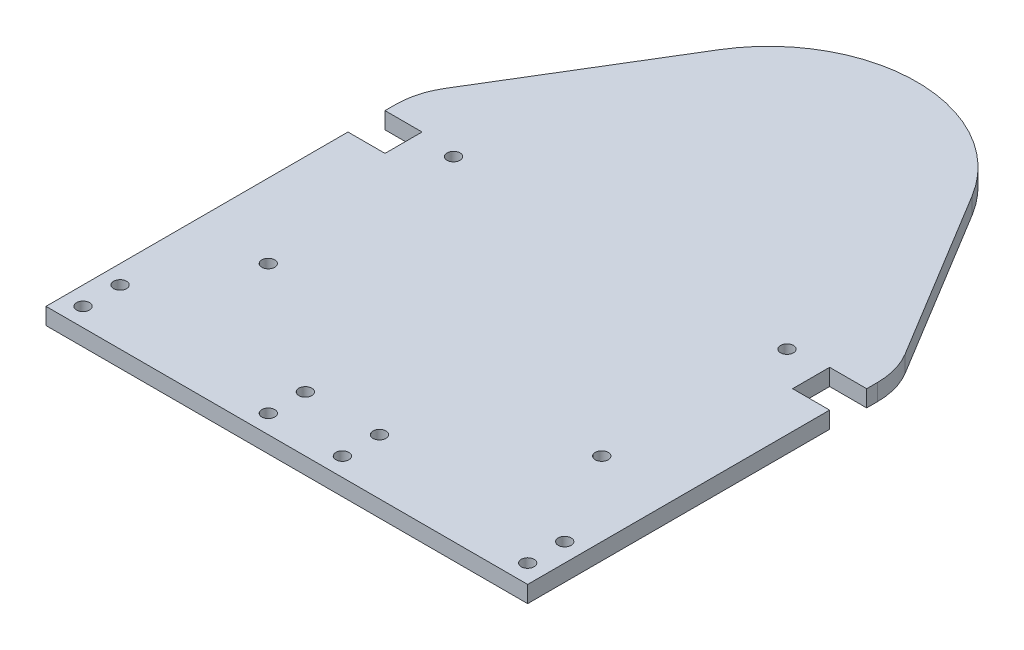
ISO-10303-21;
HEADER;
FILE_DESCRIPTION(('STEP AP214'),'2;1');
FILE_NAME('part.step','',(''),(''),'','','');
FILE_SCHEMA(('AUTOMOTIVE_DESIGN { 1 0 10303 214 1 1 1 1 }'));
ENDSEC;
DATA;
#1=APPLICATION_CONTEXT('core data for automotive mechanical design processes');
#2=APPLICATION_PROTOCOL_DEFINITION('international standard','automotive_design',2000,#1);
#3=PRODUCT_CONTEXT('',#1,'mechanical');
#4=PRODUCT('Part','Part','',(#3));
#5=PRODUCT_RELATED_PRODUCT_CATEGORY('part','',(#4));
#6=PRODUCT_DEFINITION_FORMATION('','',#4);
#7=PRODUCT_DEFINITION_CONTEXT('part definition',#1,'design');
#8=PRODUCT_DEFINITION('design','',#6,#7);
#9=PRODUCT_DEFINITION_SHAPE('','',#8);
#10=(LENGTH_UNIT() NAMED_UNIT(*) SI_UNIT(.MILLI.,.METRE.));
#11=(NAMED_UNIT(*) PLANE_ANGLE_UNIT() SI_UNIT($,.RADIAN.));
#12=(NAMED_UNIT(*) SI_UNIT($,.STERADIAN.) SOLID_ANGLE_UNIT());
#13=UNCERTAINTY_MEASURE_WITH_UNIT(LENGTH_MEASURE(1.E-05),#10,'distance_accuracy_value','');
#14=(GEOMETRIC_REPRESENTATION_CONTEXT(3) GLOBAL_UNCERTAINTY_ASSIGNED_CONTEXT((#13)) GLOBAL_UNIT_ASSIGNED_CONTEXT((#10,
#11,#12)) REPRESENTATION_CONTEXT('',''));
#15=CARTESIAN_POINT('',(0.,0.,0.));
#16=DIRECTION('',(0.,0.,1.));
#17=DIRECTION('',(1.,0.,0.));
#18=AXIS2_PLACEMENT_3D('',#15,#16,#17);
#19=CARTESIAN_POINT('',(65.,4.5,-25.));
#20=DIRECTION('',(-1.,0.,0.));
#21=DIRECTION('',(0.,0.,1.));
#22=AXIS2_PLACEMENT_3D('',#19,#20,#21);
#23=PLANE('',#22);
#24=DIRECTION('',(0.,0.,-1.));
#25=VECTOR('',#24,1.);
#26=CARTESIAN_POINT('',(65.,0.,-25.));
#27=LINE('',#26,#25);
#28=CARTESIAN_POINT('',(65.,0.,75.));
#29=VERTEX_POINT('',#28);
#30=CARTESIAN_POINT('',(65.,0.,-6.50000000000002));
#31=VERTEX_POINT('',#30);
#32=EDGE_CURVE('E288',#29,#31,#27,.T.);
#33=ORIENTED_EDGE('',*,*,#32,.T.);
#34=DIRECTION('',(0.,1.,0.));
#35=VECTOR('',#34,1.);
#36=CARTESIAN_POINT('',(65.,0.,-6.50000000000002));
#37=LINE('',#36,#35);
#38=CARTESIAN_POINT('',(65.,4.5,-6.50000000000002));
#39=VERTEX_POINT('',#38);
#40=EDGE_CURVE('E259',#31,#39,#37,.T.);
#41=ORIENTED_EDGE('',*,*,#40,.T.);
#42=DIRECTION('',(0.,0.,-1.));
#43=VECTOR('',#42,1.);
#44=CARTESIAN_POINT('',(65.,4.5,-25.));
#45=LINE('',#44,#43);
#46=CARTESIAN_POINT('',(65.,4.5,75.));
#47=VERTEX_POINT('',#46);
#48=EDGE_CURVE('E276',#47,#39,#45,.T.);
#49=ORIENTED_EDGE('',*,*,#48,.F.);
#50=DIRECTION('',(0.,-1.,0.));
#51=VECTOR('',#50,1.);
#52=CARTESIAN_POINT('',(65.,4.5,75.));
#53=LINE('',#52,#51);
#54=EDGE_CURVE('E195',#47,#29,#53,.T.);
#55=ORIENTED_EDGE('',*,*,#54,.T.);
#56=EDGE_LOOP('',(#33,#41,#49,#55));
#57=FACE_BOUND('',#56,.T.);
#58=ADVANCED_FACE('F49',(#57),#23,.F.);
#59=CARTESIAN_POINT('',(-65.,4.5,-25.));
#60=DIRECTION('',(1.,0.,0.));
#61=DIRECTION('',(0.,0.,-1.));
#62=AXIS2_PLACEMENT_3D('',#59,#60,#61);
#63=PLANE('',#62);
#64=DIRECTION('',(0.,0.,1.));
#65=VECTOR('',#64,1.);
#66=CARTESIAN_POINT('',(-65.,0.,-25.));
#67=LINE('',#66,#65);
#68=CARTESIAN_POINT('',(-65.,0.,-19.4053884885353));
#69=VERTEX_POINT('',#68);
#70=CARTESIAN_POINT('',(-65.,0.,-16.5));
#71=VERTEX_POINT('',#70);
#72=EDGE_CURVE('E184',#69,#71,#67,.T.);
#73=ORIENTED_EDGE('',*,*,#72,.T.);
#74=DIRECTION('',(0.,1.,0.));
#75=VECTOR('',#74,1.);
#76=CARTESIAN_POINT('',(-65.,0.,-16.5));
#77=LINE('',#76,#75);
#78=CARTESIAN_POINT('',(-65.,4.5,-16.5));
#79=VERTEX_POINT('',#78);
#80=EDGE_CURVE('E246',#71,#79,#77,.T.);
#81=ORIENTED_EDGE('',*,*,#80,.T.);
#82=DIRECTION('',(0.,0.,1.));
#83=VECTOR('',#82,1.);
#84=CARTESIAN_POINT('',(-65.,4.5,-25.));
#85=LINE('',#84,#83);
#86=CARTESIAN_POINT('',(-65.,4.5,-19.4053884885353));
#87=VERTEX_POINT('',#86);
#88=EDGE_CURVE('E229',#87,#79,#85,.T.);
#89=ORIENTED_EDGE('',*,*,#88,.F.);
#90=DIRECTION('',(0.,-1.,0.));
#91=VECTOR('',#90,1.);
#92=CARTESIAN_POINT('',(-65.,4.5,-19.4053884885353));
#93=LINE('',#92,#91);
#94=EDGE_CURVE('E57',#87,#69,#93,.T.);
#95=ORIENTED_EDGE('',*,*,#94,.T.);
#96=EDGE_LOOP('',(#73,#81,#89,#95));
#97=FACE_BOUND('',#96,.T.);
#98=ADVANCED_FACE('F226',(#97),#63,.F.);
#99=CARTESIAN_POINT('',(65.,4.5,-16.5));
#100=VERTEX_POINT('',#99);
#101=CARTESIAN_POINT('',(65.,4.5,-19.4053884885353));
#102=VERTEX_POINT('',#101);
#103=EDGE_CURVE('E194',#100,#102,#45,.T.);
#104=ORIENTED_EDGE('',*,*,#103,.F.);
#105=DIRECTION('',(0.,1.,0.));
#106=VECTOR('',#105,1.);
#107=CARTESIAN_POINT('',(65.,0.,-16.5));
#108=LINE('',#107,#106);
#109=CARTESIAN_POINT('',(65.,0.,-16.5));
#110=VERTEX_POINT('',#109);
#111=EDGE_CURVE('E252',#110,#100,#108,.T.);
#112=ORIENTED_EDGE('',*,*,#111,.F.);
#113=CARTESIAN_POINT('',(65.,0.,-19.4053884885353));
#114=VERTEX_POINT('',#113);
#115=EDGE_CURVE('E248',#110,#114,#27,.T.);
#116=ORIENTED_EDGE('',*,*,#115,.T.);
#117=DIRECTION('',(0.,-1.,0.));
#118=VECTOR('',#117,1.);
#119=CARTESIAN_POINT('',(65.,4.5,-19.4053884885353));
#120=LINE('',#119,#118);
#121=EDGE_CURVE('E215',#114,#102,#120,.F.);
#122=ORIENTED_EDGE('',*,*,#121,.T.);
#123=EDGE_LOOP('',(#104,#112,#116,#122));
#124=FACE_BOUND('',#123,.T.);
#125=ADVANCED_FACE('F321',(#124),#23,.F.);
#126=CARTESIAN_POINT('',(65.,4.5,-25.));
#127=DIRECTION('',(-0.854858792791353,0.,0.5188607177146));
#128=DIRECTION('',(0.5188607177146,0.,0.854858792791353));
#129=AXIS2_PLACEMENT_3D('',#126,#127,#128);
#130=PLANE('',#129);
#131=DIRECTION('',(-0.5188607177146,0.,-0.854858792791353));
#132=VECTOR('',#131,1.);
#133=CARTESIAN_POINT('',(65.,4.5,-25.));
#134=LINE('',#133,#132);
#135=CARTESIAN_POINT('',(62.0971758558271,4.5,-29.7826028428273));
#136=VERTEX_POINT('',#135);
#137=CARTESIAN_POINT('',(34.1943517116541,4.5,-75.754428708584));
#138=VERTEX_POINT('',#137);
#139=EDGE_CURVE('E279',#136,#138,#134,.T.);
#140=ORIENTED_EDGE('',*,*,#139,.F.);
#141=DIRECTION('',(0.,-1.,0.));
#142=VECTOR('',#141,1.);
#143=CARTESIAN_POINT('',(62.0971758558271,4.5,-29.7826028428273));
#144=LINE('',#143,#142);
#145=CARTESIAN_POINT('',(62.0971758558271,0.,-29.7826028428273));
#146=VERTEX_POINT('',#145);
#147=EDGE_CURVE('E207',#136,#146,#144,.T.);
#148=ORIENTED_EDGE('',*,*,#147,.T.);
#149=DIRECTION('',(-0.5188607177146,0.,-0.854858792791353));
#150=VECTOR('',#149,1.);
#151=CARTESIAN_POINT('',(65.,0.,-25.));
#152=LINE('',#151,#150);
#153=CARTESIAN_POINT('',(34.1943517116541,0.,-75.754428708584));
#154=VERTEX_POINT('',#153);
#155=EDGE_CURVE('E291',#146,#154,#152,.T.);
#156=ORIENTED_EDGE('',*,*,#155,.T.);
#157=DIRECTION('',(0.,-1.,0.));
#158=VECTOR('',#157,1.);
#159=CARTESIAN_POINT('',(34.1943517116541,4.5,-75.754428708584));
#160=LINE('',#159,#158);
#161=EDGE_CURVE('E204',#138,#154,#160,.T.);
#162=ORIENTED_EDGE('',*,*,#161,.F.);
#163=EDGE_LOOP('',(#140,#148,#156,#162));
#164=FACE_BOUND('',#163,.T.);
#165=ADVANCED_FACE('F328',(#164),#130,.F.);
#166=CARTESIAN_POINT('',(0.,4.5,-55.));
#167=DIRECTION('',(0.,-1.,0.));
#168=DIRECTION('',(0.,0.,-1.));
#169=AXIS2_PLACEMENT_3D('',#166,#167,#168);
#170=CYLINDRICAL_SURFACE('',#169,40.);
#171=CARTESIAN_POINT('',(0.,0.,-55.));
#172=DIRECTION('',(0.,1.,0.));
#173=DIRECTION('',(0.,0.,1.));
#174=AXIS2_PLACEMENT_3D('',#171,#172,#173);
#175=CIRCLE('',#174,40.);
#176=CARTESIAN_POINT('',(-34.1943517116542,0.,-75.754428708584));
#177=VERTEX_POINT('',#176);
#178=EDGE_CURVE('E189',#154,#177,#175,.T.);
#179=ORIENTED_EDGE('',*,*,#178,.T.);
#180=DIRECTION('',(0.,-1.,0.));
#181=VECTOR('',#180,1.);
#182=CARTESIAN_POINT('',(-34.1943517116542,4.5,-75.754428708584));
#183=LINE('',#182,#181);
#184=CARTESIAN_POINT('',(-34.1943517116542,4.5,-75.754428708584));
#185=VERTEX_POINT('',#184);
#186=EDGE_CURVE('E201',#185,#177,#183,.T.);
#187=ORIENTED_EDGE('',*,*,#186,.F.);
#188=CARTESIAN_POINT('',(0.,4.5,-55.));
#189=DIRECTION('',(0.,1.,0.));
#190=DIRECTION('',(0.,0.,1.));
#191=AXIS2_PLACEMENT_3D('',#188,#189,#190);
#192=CIRCLE('',#191,40.);
#193=EDGE_CURVE('E281',#138,#185,#192,.T.);
#194=ORIENTED_EDGE('',*,*,#193,.F.);
#195=ORIENTED_EDGE('',*,*,#161,.T.);
#196=EDGE_LOOP('',(#179,#187,#194,#195));
#197=FACE_BOUND('',#196,.T.);
#198=ADVANCED_FACE('F295',(#197),#170,.T.);
#199=CARTESIAN_POINT('',(-65.,4.5,-25.));
#200=DIRECTION('',(0.854858792791354,0.,0.5188607177146));
#201=DIRECTION('',(0.5188607177146,0.,-0.854858792791354));
#202=AXIS2_PLACEMENT_3D('',#199,#200,#201);
#203=PLANE('',#202);
#204=DIRECTION('',(-0.5188607177146,0.,0.854858792791354));
#205=VECTOR('',#204,1.);
#206=CARTESIAN_POINT('',(-65.,0.,-25.));
#207=LINE('',#206,#205);
#208=CARTESIAN_POINT('',(-62.0971758558271,0.,-29.7826028428273));
#209=VERTEX_POINT('',#208);
#210=EDGE_CURVE('E185',#177,#209,#207,.T.);
#211=ORIENTED_EDGE('',*,*,#210,.T.);
#212=DIRECTION('',(0.,-1.,0.));
#213=VECTOR('',#212,1.);
#214=CARTESIAN_POINT('',(-62.0971758558271,4.5,-29.7826028428273));
#215=LINE('',#214,#213);
#216=CARTESIAN_POINT('',(-62.0971758558271,4.5,-29.7826028428273));
#217=VERTEX_POINT('',#216);
#218=EDGE_CURVE('E11',#209,#217,#215,.F.);
#219=ORIENTED_EDGE('',*,*,#218,.T.);
#220=DIRECTION('',(-0.5188607177146,0.,0.854858792791354));
#221=VECTOR('',#220,1.);
#222=CARTESIAN_POINT('',(-65.,4.5,-25.));
#223=LINE('',#222,#221);
#224=EDGE_CURVE('E283',#185,#217,#223,.T.);
#225=ORIENTED_EDGE('',*,*,#224,.F.);
#226=ORIENTED_EDGE('',*,*,#186,.T.);
#227=EDGE_LOOP('',(#211,#219,#225,#226));
#228=FACE_BOUND('',#227,.T.);
#229=ADVANCED_FACE('F301',(#228),#203,.F.);
#230=CARTESIAN_POINT('',(-65.,4.5,-6.49999999999999));
#231=VERTEX_POINT('',#230);
#232=CARTESIAN_POINT('',(-65.,4.5,75.));
#233=VERTEX_POINT('',#232);
#234=EDGE_CURVE('E177',#231,#233,#85,.T.);
#235=ORIENTED_EDGE('',*,*,#234,.F.);
#236=DIRECTION('',(0.,1.,0.));
#237=VECTOR('',#236,1.);
#238=CARTESIAN_POINT('',(-65.,0.,-6.49999999999999));
#239=LINE('',#238,#237);
#240=CARTESIAN_POINT('',(-65.,0.,-6.49999999999999));
#241=VERTEX_POINT('',#240);
#242=EDGE_CURVE('E164',#241,#231,#239,.T.);
#243=ORIENTED_EDGE('',*,*,#242,.F.);
#244=CARTESIAN_POINT('',(-65.,0.,75.));
#245=VERTEX_POINT('',#244);
#246=EDGE_CURVE('E175',#241,#245,#67,.T.);
#247=ORIENTED_EDGE('',*,*,#246,.T.);
#248=DIRECTION('',(0.,-1.,0.));
#249=VECTOR('',#248,1.);
#250=CARTESIAN_POINT('',(-65.,4.5,75.));
#251=LINE('',#250,#249);
#252=EDGE_CURVE('E198',#233,#245,#251,.T.);
#253=ORIENTED_EDGE('',*,*,#252,.F.);
#254=EDGE_LOOP('',(#235,#243,#247,#253));
#255=FACE_BOUND('',#254,.T.);
#256=ADVANCED_FACE('F173',(#255),#63,.F.);
#257=CARTESIAN_POINT('',(-65.,4.5,75.));
#258=DIRECTION('',(0.,0.,-1.));
#259=DIRECTION('',(-1.,0.,0.));
#260=AXIS2_PLACEMENT_3D('',#257,#258,#259);
#261=PLANE('',#260);
#262=DIRECTION('',(1.,0.,0.));
#263=VECTOR('',#262,1.);
#264=CARTESIAN_POINT('',(-65.,0.,75.));
#265=LINE('',#264,#263);
#266=EDGE_CURVE('E183',#245,#29,#265,.T.);
#267=ORIENTED_EDGE('',*,*,#266,.T.);
#268=ORIENTED_EDGE('',*,*,#54,.F.);
#269=DIRECTION('',(1.,0.,0.));
#270=VECTOR('',#269,1.);
#271=CARTESIAN_POINT('',(-65.,4.5,75.));
#272=LINE('',#271,#270);
#273=EDGE_CURVE('E199',#233,#47,#272,.T.);
#274=ORIENTED_EDGE('',*,*,#273,.F.);
#275=ORIENTED_EDGE('',*,*,#252,.T.);
#276=EDGE_LOOP('',(#267,#268,#274,#275));
#277=FACE_BOUND('',#276,.T.);
#278=ADVANCED_FACE('F351',(#277),#261,.F.);
#279=CARTESIAN_POINT('',(0.,4.5,-55.));
#280=DIRECTION('',(0.,1.,0.));
#281=DIRECTION('',(0.,0.,1.));
#282=AXIS2_PLACEMENT_3D('',#279,#280,#281);
#283=PLANE('',#282);
#284=CARTESIAN_POINT('',(9.99999999999997,4.5,60.));
#285=DIRECTION('',(0.,1.,0.));
#286=DIRECTION('',(0.,0.,1.));
#287=AXIS2_PLACEMENT_3D('',#284,#285,#286);
#288=CIRCLE('',#287,1.75);
#289=CARTESIAN_POINT('',(9.99999999999997,4.5,61.75));
#290=VERTEX_POINT('',#289);
#291=EDGE_CURVE('E645',#290,#290,#288,.T.);
#292=ORIENTED_EDGE('',*,*,#291,.F.);
#293=EDGE_LOOP('',(#292));
#294=FACE_BOUND('',#293,.T.);
#295=CARTESIAN_POINT('',(-10.,4.5,70.));
#296=DIRECTION('',(0.,1.,0.));
#297=DIRECTION('',(0.,0.,1.));
#298=AXIS2_PLACEMENT_3D('',#295,#296,#297);
#299=CIRCLE('',#298,1.75);
#300=CARTESIAN_POINT('',(-10.,4.5,71.75));
#301=VERTEX_POINT('',#300);
#302=EDGE_CURVE('E651',#301,#301,#299,.T.);
#303=ORIENTED_EDGE('',*,*,#302,.F.);
#304=EDGE_LOOP('',(#303));
#305=FACE_BOUND('',#304,.T.);
#306=CARTESIAN_POINT('',(9.99999999999997,4.5,70.));
#307=DIRECTION('',(0.,1.,0.));
#308=DIRECTION('',(0.,0.,1.));
#309=AXIS2_PLACEMENT_3D('',#306,#307,#308);
#310=CIRCLE('',#309,1.75);
#311=CARTESIAN_POINT('',(9.99999999999997,4.5,71.75));
#312=VERTEX_POINT('',#311);
#313=EDGE_CURVE('E662',#312,#312,#310,.T.);
#314=ORIENTED_EDGE('',*,*,#313,.F.);
#315=EDGE_LOOP('',(#314));
#316=FACE_BOUND('',#315,.T.);
#317=CARTESIAN_POINT('',(-45.,4.5,-15.));
#318=DIRECTION('',(0.,1.,0.));
#319=DIRECTION('',(0.,0.,1.));
#320=AXIS2_PLACEMENT_3D('',#317,#318,#319);
#321=CIRCLE('',#320,1.75);
#322=CARTESIAN_POINT('',(-45.,4.5,-13.25));
#323=VERTEX_POINT('',#322);
#324=EDGE_CURVE('E718',#323,#323,#321,.T.);
#325=ORIENTED_EDGE('',*,*,#324,.F.);
#326=EDGE_LOOP('',(#325));
#327=FACE_BOUND('',#326,.T.);
#328=CARTESIAN_POINT('',(60.,4.5,60.));
#329=DIRECTION('',(0.,1.,0.));
#330=DIRECTION('',(0.,0.,1.));
#331=AXIS2_PLACEMENT_3D('',#328,#329,#330);
#332=CIRCLE('',#331,1.75);
#333=CARTESIAN_POINT('',(60.,4.5,61.75));
#334=VERTEX_POINT('',#333);
#335=EDGE_CURVE('E672',#334,#334,#332,.T.);
#336=ORIENTED_EDGE('',*,*,#335,.F.);
#337=EDGE_LOOP('',(#336));
#338=FACE_BOUND('',#337,.T.);
#339=CARTESIAN_POINT('',(-60.,4.5,60.));
#340=DIRECTION('',(0.,1.,0.));
#341=DIRECTION('',(0.,0.,1.));
#342=AXIS2_PLACEMENT_3D('',#339,#340,#341);
#343=CIRCLE('',#342,1.75);
#344=CARTESIAN_POINT('',(-60.,4.5,61.75));
#345=VERTEX_POINT('',#344);
#346=EDGE_CURVE('E679',#345,#345,#343,.T.);
#347=ORIENTED_EDGE('',*,*,#346,.F.);
#348=EDGE_LOOP('',(#347));
#349=FACE_BOUND('',#348,.T.);
#350=CARTESIAN_POINT('',(60.,4.5,70.));
#351=DIRECTION('',(0.,1.,0.));
#352=DIRECTION('',(0.,0.,1.));
#353=AXIS2_PLACEMENT_3D('',#350,#351,#352);
#354=CIRCLE('',#353,1.75);
#355=CARTESIAN_POINT('',(60.,4.5,71.75));
#356=VERTEX_POINT('',#355);
#357=EDGE_CURVE('E663',#356,#356,#354,.T.);
#358=ORIENTED_EDGE('',*,*,#357,.F.);
#359=EDGE_LOOP('',(#358));
#360=FACE_BOUND('',#359,.T.);
#361=CARTESIAN_POINT('',(-10.,4.5,60.));
#362=DIRECTION('',(0.,1.,0.));
#363=DIRECTION('',(0.,0.,1.));
#364=AXIS2_PLACEMENT_3D('',#361,#362,#363);
#365=CIRCLE('',#364,1.75);
#366=CARTESIAN_POINT('',(-10.,4.5,61.75));
#367=VERTEX_POINT('',#366);
#368=EDGE_CURVE('E649',#367,#367,#365,.T.);
#369=ORIENTED_EDGE('',*,*,#368,.F.);
#370=EDGE_LOOP('',(#369));
#371=FACE_BOUND('',#370,.T.);
#372=CARTESIAN_POINT('',(45.,4.5,35.));
#373=DIRECTION('',(0.,1.,0.));
#374=DIRECTION('',(0.,0.,1.));
#375=AXIS2_PLACEMENT_3D('',#372,#373,#374);
#376=CIRCLE('',#375,1.75);
#377=CARTESIAN_POINT('',(45.,4.5,36.75));
#378=VERTEX_POINT('',#377);
#379=EDGE_CURVE('E706',#378,#378,#376,.T.);
#380=ORIENTED_EDGE('',*,*,#379,.F.);
#381=EDGE_LOOP('',(#380));
#382=FACE_BOUND('',#381,.T.);
#383=CARTESIAN_POINT('',(45.,4.5,-15.));
#384=DIRECTION('',(0.,1.,0.));
#385=DIRECTION('',(0.,0.,1.));
#386=AXIS2_PLACEMENT_3D('',#383,#384,#385);
#387=CIRCLE('',#386,1.75);
#388=CARTESIAN_POINT('',(45.,4.5,-13.25));
#389=VERTEX_POINT('',#388);
#390=EDGE_CURVE('E710',#389,#389,#387,.T.);
#391=ORIENTED_EDGE('',*,*,#390,.F.);
#392=EDGE_LOOP('',(#391));
#393=FACE_BOUND('',#392,.T.);
#394=CARTESIAN_POINT('',(-45.,4.5,35.));
#395=DIRECTION('',(0.,1.,0.));
#396=DIRECTION('',(0.,0.,1.));
#397=AXIS2_PLACEMENT_3D('',#394,#395,#396);
#398=CIRCLE('',#397,1.75);
#399=CARTESIAN_POINT('',(-45.,4.5,36.75));
#400=VERTEX_POINT('',#399);
#401=EDGE_CURVE('E713',#400,#400,#398,.T.);
#402=ORIENTED_EDGE('',*,*,#401,.F.);
#403=EDGE_LOOP('',(#402));
#404=FACE_BOUND('',#403,.T.);
#405=CARTESIAN_POINT('',(-60.,4.5,70.));
#406=DIRECTION('',(0.,1.,0.));
#407=DIRECTION('',(0.,0.,1.));
#408=AXIS2_PLACEMENT_3D('',#405,#406,#407);
#409=CIRCLE('',#408,1.75);
#410=CARTESIAN_POINT('',(-60.,4.5,71.75));
#411=VERTEX_POINT('',#410);
#412=EDGE_CURVE('E675',#411,#411,#409,.T.);
#413=ORIENTED_EDGE('',*,*,#412,.F.);
#414=EDGE_LOOP('',(#413));
#415=FACE_BOUND('',#414,.T.);
#416=DIRECTION('',(-1.,0.,0.));
#417=VECTOR('',#416,1.);
#418=CARTESIAN_POINT('',(-65.,4.5,-16.5));
#419=LINE('',#418,#417);
#420=CARTESIAN_POINT('',(-55.,4.5,-16.5));
#421=VERTEX_POINT('',#420);
#422=EDGE_CURVE('E169',#421,#79,#419,.T.);
#423=ORIENTED_EDGE('',*,*,#422,.F.);
#424=DIRECTION('',(0.,0.,-1.));
#425=VECTOR('',#424,1.);
#426=CARTESIAN_POINT('',(-55.,4.5,-16.5));
#427=LINE('',#426,#425);
#428=CARTESIAN_POINT('',(-55.,4.5,-6.49999999999999));
#429=VERTEX_POINT('',#428);
#430=EDGE_CURVE('E241',#429,#421,#427,.T.);
#431=ORIENTED_EDGE('',*,*,#430,.F.);
#432=DIRECTION('',(1.,0.,0.));
#433=VECTOR('',#432,1.);
#434=CARTESIAN_POINT('',(-65.,4.5,-6.49999999999999));
#435=LINE('',#434,#433);
#436=EDGE_CURVE('E239',#231,#429,#435,.T.);
#437=ORIENTED_EDGE('',*,*,#436,.F.);
#438=ORIENTED_EDGE('',*,*,#234,.T.);
#439=ORIENTED_EDGE('',*,*,#273,.T.);
#440=ORIENTED_EDGE('',*,*,#48,.T.);
#441=DIRECTION('',(1.,0.,0.));
#442=VECTOR('',#441,1.);
#443=CARTESIAN_POINT('',(65.,4.5,-6.50000000000002));
#444=LINE('',#443,#442);
#445=CARTESIAN_POINT('',(55.,4.5,-6.50000000000002));
#446=VERTEX_POINT('',#445);
#447=EDGE_CURVE('E263',#446,#39,#444,.T.);
#448=ORIENTED_EDGE('',*,*,#447,.F.);
#449=DIRECTION('',(0.,0.,1.));
#450=VECTOR('',#449,1.);
#451=CARTESIAN_POINT('',(55.,4.5,-16.5));
#452=LINE('',#451,#450);
#453=CARTESIAN_POINT('',(55.,4.5,-16.5));
#454=VERTEX_POINT('',#453);
#455=EDGE_CURVE('E265',#454,#446,#452,.T.);
#456=ORIENTED_EDGE('',*,*,#455,.F.);
#457=DIRECTION('',(-1.,0.,0.));
#458=VECTOR('',#457,1.);
#459=CARTESIAN_POINT('',(65.,4.5,-16.5));
#460=LINE('',#459,#458);
#461=EDGE_CURVE('E242',#100,#454,#460,.T.);
#462=ORIENTED_EDGE('',*,*,#461,.F.);
#463=ORIENTED_EDGE('',*,*,#103,.T.);
#464=CARTESIAN_POINT('',(45.,4.5,-19.4053884885353));
#465=DIRECTION('',(0.,1.,0.));
#466=DIRECTION('',(0.,0.,1.));
#467=AXIS2_PLACEMENT_3D('',#464,#465,#466);
#468=CIRCLE('',#467,20.);
#469=EDGE_CURVE('E220',#102,#136,#468,.T.);
#470=ORIENTED_EDGE('',*,*,#469,.T.);
#471=ORIENTED_EDGE('',*,*,#139,.T.);
#472=ORIENTED_EDGE('',*,*,#193,.T.);
#473=ORIENTED_EDGE('',*,*,#224,.T.);
#474=CARTESIAN_POINT('',(-45.,4.5,-19.4053884885353));
#475=DIRECTION('',(0.,1.,0.));
#476=DIRECTION('',(0.,0.,1.));
#477=AXIS2_PLACEMENT_3D('',#474,#475,#476);
#478=CIRCLE('',#477,20.);
#479=EDGE_CURVE('E218',#217,#87,#478,.T.);
#480=ORIENTED_EDGE('',*,*,#479,.T.);
#481=ORIENTED_EDGE('',*,*,#88,.T.);
#482=EDGE_LOOP('',(#423,#431,#437,#438,#439,#440,#448,#456,#462,#463,#470,#471,#472,#473,#480,#481));
#483=FACE_BOUND('',#482,.T.);
#484=ADVANCED_FACE('F305',(#294,#305,#316,#327,#338,#349,#360,#371,#382,#393,#404,#415,#483),
#283,.T.);
#485=CARTESIAN_POINT('',(0.,0.,-55.));
#486=DIRECTION('',(0.,1.,0.));
#487=DIRECTION('',(0.,0.,1.));
#488=AXIS2_PLACEMENT_3D('',#485,#486,#487);
#489=PLANE('',#488);
#490=CARTESIAN_POINT('',(9.99999999999997,0.,60.));
#491=DIRECTION('',(0.,1.,0.));
#492=DIRECTION('',(0.,0.,1.));
#493=AXIS2_PLACEMENT_3D('',#490,#491,#492);
#494=CIRCLE('',#493,1.75);
#495=CARTESIAN_POINT('',(9.99999999999997,0.,61.75));
#496=VERTEX_POINT('',#495);
#497=EDGE_CURVE('E642',#496,#496,#494,.T.);
#498=ORIENTED_EDGE('',*,*,#497,.T.);
#499=EDGE_LOOP('',(#498));
#500=FACE_BOUND('',#499,.T.);
#501=CARTESIAN_POINT('',(-10.,0.,70.));
#502=DIRECTION('',(0.,1.,0.));
#503=DIRECTION('',(0.,0.,1.));
#504=AXIS2_PLACEMENT_3D('',#501,#502,#503);
#505=CIRCLE('',#504,1.75);
#506=CARTESIAN_POINT('',(-10.,0.,71.75));
#507=VERTEX_POINT('',#506);
#508=EDGE_CURVE('E659',#507,#507,#505,.T.);
#509=ORIENTED_EDGE('',*,*,#508,.T.);
#510=EDGE_LOOP('',(#509));
#511=FACE_BOUND('',#510,.T.);
#512=CARTESIAN_POINT('',(9.99999999999997,0.,70.));
#513=DIRECTION('',(0.,1.,0.));
#514=DIRECTION('',(0.,0.,1.));
#515=AXIS2_PLACEMENT_3D('',#512,#513,#514);
#516=CIRCLE('',#515,1.75);
#517=CARTESIAN_POINT('',(9.99999999999997,0.,71.75));
#518=VERTEX_POINT('',#517);
#519=EDGE_CURVE('E731',#518,#518,#516,.T.);
#520=ORIENTED_EDGE('',*,*,#519,.T.);
#521=EDGE_LOOP('',(#520));
#522=FACE_BOUND('',#521,.T.);
#523=CARTESIAN_POINT('',(-45.,0.,-15.));
#524=DIRECTION('',(0.,1.,0.));
#525=DIRECTION('',(0.,0.,1.));
#526=AXIS2_PLACEMENT_3D('',#523,#524,#525);
#527=CIRCLE('',#526,1.75);
#528=CARTESIAN_POINT('',(-45.,0.,-13.25));
#529=VERTEX_POINT('',#528);
#530=EDGE_CURVE('E654',#529,#529,#527,.T.);
#531=ORIENTED_EDGE('',*,*,#530,.T.);
#532=EDGE_LOOP('',(#531));
#533=FACE_BOUND('',#532,.T.);
#534=CARTESIAN_POINT('',(60.,0.,60.));
#535=DIRECTION('',(0.,1.,0.));
#536=DIRECTION('',(0.,0.,1.));
#537=AXIS2_PLACEMENT_3D('',#534,#535,#536);
#538=CIRCLE('',#537,1.75);
#539=CARTESIAN_POINT('',(60.,0.,61.75));
#540=VERTEX_POINT('',#539);
#541=EDGE_CURVE('E676',#540,#540,#538,.T.);
#542=ORIENTED_EDGE('',*,*,#541,.T.);
#543=EDGE_LOOP('',(#542));
#544=FACE_BOUND('',#543,.T.);
#545=CARTESIAN_POINT('',(-60.,0.,60.));
#546=DIRECTION('',(0.,1.,0.));
#547=DIRECTION('',(0.,0.,1.));
#548=AXIS2_PLACEMENT_3D('',#545,#546,#547);
#549=CIRCLE('',#548,1.75);
#550=CARTESIAN_POINT('',(-60.,0.,61.75));
#551=VERTEX_POINT('',#550);
#552=EDGE_CURVE('E666',#551,#551,#549,.T.);
#553=ORIENTED_EDGE('',*,*,#552,.T.);
#554=EDGE_LOOP('',(#553));
#555=FACE_BOUND('',#554,.T.);
#556=CARTESIAN_POINT('',(60.,0.,70.));
#557=DIRECTION('',(0.,1.,0.));
#558=DIRECTION('',(0.,0.,1.));
#559=AXIS2_PLACEMENT_3D('',#556,#557,#558);
#560=CIRCLE('',#559,1.75);
#561=CARTESIAN_POINT('',(60.,0.,71.75));
#562=VERTEX_POINT('',#561);
#563=EDGE_CURVE('E667',#562,#562,#560,.T.);
#564=ORIENTED_EDGE('',*,*,#563,.T.);
#565=EDGE_LOOP('',(#564));
#566=FACE_BOUND('',#565,.T.);
#567=CARTESIAN_POINT('',(-10.,0.,60.));
#568=DIRECTION('',(0.,1.,0.));
#569=DIRECTION('',(0.,0.,1.));
#570=AXIS2_PLACEMENT_3D('',#567,#568,#569);
#571=CIRCLE('',#570,1.75);
#572=CARTESIAN_POINT('',(-10.,0.,61.75));
#573=VERTEX_POINT('',#572);
#574=EDGE_CURVE('E646',#573,#573,#571,.T.);
#575=ORIENTED_EDGE('',*,*,#574,.T.);
#576=EDGE_LOOP('',(#575));
#577=FACE_BOUND('',#576,.T.);
#578=CARTESIAN_POINT('',(45.,0.,35.));
#579=DIRECTION('',(0.,1.,0.));
#580=DIRECTION('',(0.,0.,1.));
#581=AXIS2_PLACEMENT_3D('',#578,#579,#580);
#582=CIRCLE('',#581,1.75);
#583=CARTESIAN_POINT('',(45.,0.,36.75));
#584=VERTEX_POINT('',#583);
#585=EDGE_CURVE('E722',#584,#584,#582,.T.);
#586=ORIENTED_EDGE('',*,*,#585,.T.);
#587=EDGE_LOOP('',(#586));
#588=FACE_BOUND('',#587,.T.);
#589=CARTESIAN_POINT('',(45.,0.,-15.));
#590=DIRECTION('',(0.,1.,0.));
#591=DIRECTION('',(0.,0.,1.));
#592=AXIS2_PLACEMENT_3D('',#589,#590,#591);
#593=CIRCLE('',#592,1.75);
#594=CARTESIAN_POINT('',(45.,0.,-13.25));
#595=VERTEX_POINT('',#594);
#596=EDGE_CURVE('E726',#595,#595,#593,.T.);
#597=ORIENTED_EDGE('',*,*,#596,.T.);
#598=EDGE_LOOP('',(#597));
#599=FACE_BOUND('',#598,.T.);
#600=CARTESIAN_POINT('',(-45.,0.,35.));
#601=DIRECTION('',(0.,1.,0.));
#602=DIRECTION('',(0.,0.,1.));
#603=AXIS2_PLACEMENT_3D('',#600,#601,#602);
#604=CIRCLE('',#603,1.75);
#605=CARTESIAN_POINT('',(-45.,0.,36.75));
#606=VERTEX_POINT('',#605);
#607=EDGE_CURVE('E715',#606,#606,#604,.T.);
#608=ORIENTED_EDGE('',*,*,#607,.T.);
#609=EDGE_LOOP('',(#608));
#610=FACE_BOUND('',#609,.T.);
#611=CARTESIAN_POINT('',(-60.,0.,70.));
#612=DIRECTION('',(0.,1.,0.));
#613=DIRECTION('',(0.,0.,1.));
#614=AXIS2_PLACEMENT_3D('',#611,#612,#613);
#615=CIRCLE('',#614,1.75);
#616=CARTESIAN_POINT('',(-60.,0.,71.75));
#617=VERTEX_POINT('',#616);
#618=EDGE_CURVE('E262',#617,#617,#615,.T.);
#619=ORIENTED_EDGE('',*,*,#618,.T.);
#620=EDGE_LOOP('',(#619));
#621=FACE_BOUND('',#620,.T.);
#622=DIRECTION('',(0.,0.,-1.));
#623=VECTOR('',#622,1.);
#624=CARTESIAN_POINT('',(-55.,0.,-16.5));
#625=LINE('',#624,#623);
#626=CARTESIAN_POINT('',(-55.,0.,-6.5));
#627=VERTEX_POINT('',#626);
#628=CARTESIAN_POINT('',(-55.,0.,-16.5));
#629=VERTEX_POINT('',#628);
#630=EDGE_CURVE('E64',#627,#629,#625,.T.);
#631=ORIENTED_EDGE('',*,*,#630,.T.);
#632=DIRECTION('',(-1.,0.,0.));
#633=VECTOR('',#632,1.);
#634=CARTESIAN_POINT('',(-65.,0.,-16.5));
#635=LINE('',#634,#633);
#636=EDGE_CURVE('E178',#629,#71,#635,.T.);
#637=ORIENTED_EDGE('',*,*,#636,.T.);
#638=ORIENTED_EDGE('',*,*,#72,.F.);
#639=CARTESIAN_POINT('',(-45.,0.,-19.4053884885353));
#640=DIRECTION('',(0.,1.,0.));
#641=DIRECTION('',(0.,0.,1.));
#642=AXIS2_PLACEMENT_3D('',#639,#640,#641);
#643=CIRCLE('',#642,20.);
#644=EDGE_CURVE('E210',#69,#209,#643,.F.);
#645=ORIENTED_EDGE('',*,*,#644,.T.);
#646=ORIENTED_EDGE('',*,*,#210,.F.);
#647=ORIENTED_EDGE('',*,*,#178,.F.);
#648=ORIENTED_EDGE('',*,*,#155,.F.);
#649=CARTESIAN_POINT('',(45.,0.,-19.4053884885353));
#650=DIRECTION('',(0.,1.,0.));
#651=DIRECTION('',(0.,0.,1.));
#652=AXIS2_PLACEMENT_3D('',#649,#650,#651);
#653=CIRCLE('',#652,20.);
#654=EDGE_CURVE('E212',#146,#114,#653,.F.);
#655=ORIENTED_EDGE('',*,*,#654,.T.);
#656=ORIENTED_EDGE('',*,*,#115,.F.);
#657=DIRECTION('',(-1.,0.,0.));
#658=VECTOR('',#657,1.);
#659=CARTESIAN_POINT('',(65.,0.,-16.5));
#660=LINE('',#659,#658);
#661=CARTESIAN_POINT('',(55.,0.,-16.5));
#662=VERTEX_POINT('',#661);
#663=EDGE_CURVE('E266',#110,#662,#660,.T.);
#664=ORIENTED_EDGE('',*,*,#663,.T.);
#665=DIRECTION('',(0.,0.,1.));
#666=VECTOR('',#665,1.);
#667=CARTESIAN_POINT('',(55.,0.,-16.5));
#668=LINE('',#667,#666);
#669=CARTESIAN_POINT('',(55.,0.,-6.50000000000002));
#670=VERTEX_POINT('',#669);
#671=EDGE_CURVE('E72',#662,#670,#668,.T.);
#672=ORIENTED_EDGE('',*,*,#671,.T.);
#673=DIRECTION('',(1.,0.,0.));
#674=VECTOR('',#673,1.);
#675=CARTESIAN_POINT('',(65.,0.,-6.50000000000002));
#676=LINE('',#675,#674);
#677=EDGE_CURVE('E254',#670,#31,#676,.T.);
#678=ORIENTED_EDGE('',*,*,#677,.T.);
#679=ORIENTED_EDGE('',*,*,#32,.F.);
#680=ORIENTED_EDGE('',*,*,#266,.F.);
#681=ORIENTED_EDGE('',*,*,#246,.F.);
#682=DIRECTION('',(1.,0.,0.));
#683=VECTOR('',#682,1.);
#684=CARTESIAN_POINT('',(-65.,0.,-6.49999999999999));
#685=LINE('',#684,#683);
#686=EDGE_CURVE('E160',#241,#627,#685,.T.);
#687=ORIENTED_EDGE('',*,*,#686,.T.);
#688=EDGE_LOOP('',(#631,#637,#638,#645,#646,#647,#648,#655,#656,#664,#672,#678,#679,#680,#681,#687));
#689=FACE_BOUND('',#688,.T.);
#690=ADVANCED_FACE('F181',(#500,#511,#522,#533,#544,#555,#566,#577,#588,#599,#610,#621,#689),
#489,.F.);
#691=CARTESIAN_POINT('',(45.,4.5,-19.4053884885353));
#692=DIRECTION('',(0.,-1.,0.));
#693=DIRECTION('',(0.,0.,-1.));
#694=AXIS2_PLACEMENT_3D('',#691,#692,#693);
#695=CYLINDRICAL_SURFACE('',#694,20.);
#696=ORIENTED_EDGE('',*,*,#469,.F.);
#697=ORIENTED_EDGE('',*,*,#121,.F.);
#698=ORIENTED_EDGE('',*,*,#654,.F.);
#699=ORIENTED_EDGE('',*,*,#147,.F.);
#700=EDGE_LOOP('',(#696,#697,#698,#699));
#701=FACE_BOUND('',#700,.T.);
#702=ADVANCED_FACE('F308',(#701),#695,.T.);
#703=CARTESIAN_POINT('',(-45.,4.5,-19.4053884885353));
#704=DIRECTION('',(0.,-1.,0.));
#705=DIRECTION('',(0.,0.,-1.));
#706=AXIS2_PLACEMENT_3D('',#703,#704,#705);
#707=CYLINDRICAL_SURFACE('',#706,20.);
#708=ORIENTED_EDGE('',*,*,#479,.F.);
#709=ORIENTED_EDGE('',*,*,#218,.F.);
#710=ORIENTED_EDGE('',*,*,#644,.F.);
#711=ORIENTED_EDGE('',*,*,#94,.F.);
#712=EDGE_LOOP('',(#708,#709,#710,#711));
#713=FACE_BOUND('',#712,.T.);
#714=ADVANCED_FACE('F51',(#713),#707,.T.);
#715=CARTESIAN_POINT('',(65.,0.,-6.50000000000002));
#716=DIRECTION('',(0.,0.,1.));
#717=DIRECTION('',(1.,0.,0.));
#718=AXIS2_PLACEMENT_3D('',#715,#716,#717);
#719=PLANE('',#718);
#720=ORIENTED_EDGE('',*,*,#447,.T.);
#721=ORIENTED_EDGE('',*,*,#40,.F.);
#722=ORIENTED_EDGE('',*,*,#677,.F.);
#723=DIRECTION('',(0.,1.,0.));
#724=VECTOR('',#723,1.);
#725=CARTESIAN_POINT('',(55.,0.,-6.50000000000002));
#726=LINE('',#725,#724);
#727=EDGE_CURVE('E257',#670,#446,#726,.T.);
#728=ORIENTED_EDGE('',*,*,#727,.T.);
#729=EDGE_LOOP('',(#720,#721,#722,#728));
#730=FACE_BOUND('',#729,.T.);
#731=ADVANCED_FACE('F307',(#730),#719,.F.);
#732=CARTESIAN_POINT('',(55.,0.,-16.5));
#733=DIRECTION('',(-1.,0.,0.));
#734=DIRECTION('',(0.,0.,1.));
#735=AXIS2_PLACEMENT_3D('',#732,#733,#734);
#736=PLANE('',#735);
#737=ORIENTED_EDGE('',*,*,#455,.T.);
#738=ORIENTED_EDGE('',*,*,#727,.F.);
#739=ORIENTED_EDGE('',*,*,#671,.F.);
#740=DIRECTION('',(0.,1.,0.));
#741=VECTOR('',#740,1.);
#742=CARTESIAN_POINT('',(55.,0.,-16.5));
#743=LINE('',#742,#741);
#744=EDGE_CURVE('E255',#662,#454,#743,.T.);
#745=ORIENTED_EDGE('',*,*,#744,.T.);
#746=EDGE_LOOP('',(#737,#738,#739,#745));
#747=FACE_BOUND('',#746,.T.);
#748=ADVANCED_FACE('F314',(#747),#736,.F.);
#749=CARTESIAN_POINT('',(65.,0.,-16.5));
#750=DIRECTION('',(0.,0.,-1.));
#751=DIRECTION('',(-1.,0.,0.));
#752=AXIS2_PLACEMENT_3D('',#749,#750,#751);
#753=PLANE('',#752);
#754=ORIENTED_EDGE('',*,*,#461,.T.);
#755=ORIENTED_EDGE('',*,*,#744,.F.);
#756=ORIENTED_EDGE('',*,*,#663,.F.);
#757=ORIENTED_EDGE('',*,*,#111,.T.);
#758=EDGE_LOOP('',(#754,#755,#756,#757));
#759=FACE_BOUND('',#758,.T.);
#760=ADVANCED_FACE('F344',(#759),#753,.F.);
#761=CARTESIAN_POINT('',(-65.,0.,-16.5));
#762=DIRECTION('',(0.,0.,-1.));
#763=DIRECTION('',(-1.,0.,0.));
#764=AXIS2_PLACEMENT_3D('',#761,#762,#763);
#765=PLANE('',#764);
#766=ORIENTED_EDGE('',*,*,#422,.T.);
#767=ORIENTED_EDGE('',*,*,#80,.F.);
#768=ORIENTED_EDGE('',*,*,#636,.F.);
#769=DIRECTION('',(0.,1.,0.));
#770=VECTOR('',#769,1.);
#771=CARTESIAN_POINT('',(-55.,0.,-16.5));
#772=LINE('',#771,#770);
#773=EDGE_CURVE('E249',#629,#421,#772,.T.);
#774=ORIENTED_EDGE('',*,*,#773,.T.);
#775=EDGE_LOOP('',(#766,#767,#768,#774));
#776=FACE_BOUND('',#775,.T.);
#777=ADVANCED_FACE('F354',(#776),#765,.F.);
#778=CARTESIAN_POINT('',(-55.,0.,-16.5));
#779=DIRECTION('',(1.,0.,0.));
#780=DIRECTION('',(0.,0.,-1.));
#781=AXIS2_PLACEMENT_3D('',#778,#779,#780);
#782=PLANE('',#781);
#783=ORIENTED_EDGE('',*,*,#430,.T.);
#784=ORIENTED_EDGE('',*,*,#773,.F.);
#785=ORIENTED_EDGE('',*,*,#630,.F.);
#786=DIRECTION('',(0.,1.,0.));
#787=VECTOR('',#786,1.);
#788=CARTESIAN_POINT('',(-55.,0.,-6.49999999999999));
#789=LINE('',#788,#787);
#790=EDGE_CURVE('E166',#627,#429,#789,.T.);
#791=ORIENTED_EDGE('',*,*,#790,.T.);
#792=EDGE_LOOP('',(#783,#784,#785,#791));
#793=FACE_BOUND('',#792,.T.);
#794=ADVANCED_FACE('F353',(#793),#782,.F.);
#795=CARTESIAN_POINT('',(-65.,0.,-6.49999999999999));
#796=DIRECTION('',(0.,0.,1.));
#797=DIRECTION('',(1.,0.,0.));
#798=AXIS2_PLACEMENT_3D('',#795,#796,#797);
#799=PLANE('',#798);
#800=ORIENTED_EDGE('',*,*,#436,.T.);
#801=ORIENTED_EDGE('',*,*,#790,.F.);
#802=ORIENTED_EDGE('',*,*,#686,.F.);
#803=ORIENTED_EDGE('',*,*,#242,.T.);
#804=EDGE_LOOP('',(#800,#801,#802,#803));
#805=FACE_BOUND('',#804,.T.);
#806=ADVANCED_FACE('F163',(#805),#799,.F.);
#807=CARTESIAN_POINT('',(-60.,0.,70.));
#808=DIRECTION('',(0.,1.,0.));
#809=DIRECTION('',(0.,0.,1.));
#810=AXIS2_PLACEMENT_3D('',#807,#808,#809);
#811=CYLINDRICAL_SURFACE('',#810,1.75);
#812=ORIENTED_EDGE('',*,*,#618,.F.);
#813=EDGE_LOOP('',(#812));
#814=FACE_BOUND('',#813,.T.);
#815=ORIENTED_EDGE('',*,*,#412,.T.);
#816=EDGE_LOOP('',(#815));
#817=FACE_BOUND('',#816,.T.);
#818=ADVANCED_FACE('F364',(#814,#817),#811,.F.);
#819=CARTESIAN_POINT('',(-45.,0.,35.));
#820=DIRECTION('',(0.,1.,0.));
#821=DIRECTION('',(0.,0.,1.));
#822=AXIS2_PLACEMENT_3D('',#819,#820,#821);
#823=CYLINDRICAL_SURFACE('',#822,1.75);
#824=ORIENTED_EDGE('',*,*,#607,.F.);
#825=EDGE_LOOP('',(#824));
#826=FACE_BOUND('',#825,.T.);
#827=ORIENTED_EDGE('',*,*,#401,.T.);
#828=EDGE_LOOP('',(#827));
#829=FACE_BOUND('',#828,.T.);
#830=ADVANCED_FACE('F421',(#826,#829),#823,.F.);
#831=CARTESIAN_POINT('',(45.,0.,-15.));
#832=DIRECTION('',(0.,1.,0.));
#833=DIRECTION('',(0.,0.,1.));
#834=AXIS2_PLACEMENT_3D('',#831,#832,#833);
#835=CYLINDRICAL_SURFACE('',#834,1.75);
#836=ORIENTED_EDGE('',*,*,#596,.F.);
#837=EDGE_LOOP('',(#836));
#838=FACE_BOUND('',#837,.T.);
#839=ORIENTED_EDGE('',*,*,#390,.T.);
#840=EDGE_LOOP('',(#839));
#841=FACE_BOUND('',#840,.T.);
#842=ADVANCED_FACE('F430',(#838,#841),#835,.F.);
#843=CARTESIAN_POINT('',(45.,0.,35.));
#844=DIRECTION('',(0.,1.,0.));
#845=DIRECTION('',(0.,0.,1.));
#846=AXIS2_PLACEMENT_3D('',#843,#844,#845);
#847=CYLINDRICAL_SURFACE('',#846,1.75);
#848=ORIENTED_EDGE('',*,*,#585,.F.);
#849=EDGE_LOOP('',(#848));
#850=FACE_BOUND('',#849,.T.);
#851=ORIENTED_EDGE('',*,*,#379,.T.);
#852=EDGE_LOOP('',(#851));
#853=FACE_BOUND('',#852,.T.);
#854=ADVANCED_FACE('F439',(#850,#853),#847,.F.);
#855=CARTESIAN_POINT('',(-10.,0.,60.));
#856=DIRECTION('',(0.,1.,0.));
#857=DIRECTION('',(0.,0.,1.));
#858=AXIS2_PLACEMENT_3D('',#855,#856,#857);
#859=CYLINDRICAL_SURFACE('',#858,1.75);
#860=ORIENTED_EDGE('',*,*,#574,.F.);
#861=EDGE_LOOP('',(#860));
#862=FACE_BOUND('',#861,.T.);
#863=ORIENTED_EDGE('',*,*,#368,.T.);
#864=EDGE_LOOP('',(#863));
#865=FACE_BOUND('',#864,.T.);
#866=ADVANCED_FACE('F448',(#862,#865),#859,.F.);
#867=CARTESIAN_POINT('',(60.,0.,70.));
#868=DIRECTION('',(0.,1.,0.));
#869=DIRECTION('',(0.,0.,1.));
#870=AXIS2_PLACEMENT_3D('',#867,#868,#869);
#871=CYLINDRICAL_SURFACE('',#870,1.75);
#872=ORIENTED_EDGE('',*,*,#563,.F.);
#873=EDGE_LOOP('',(#872));
#874=FACE_BOUND('',#873,.T.);
#875=ORIENTED_EDGE('',*,*,#357,.T.);
#876=EDGE_LOOP('',(#875));
#877=FACE_BOUND('',#876,.T.);
#878=ADVANCED_FACE('F457',(#874,#877),#871,.F.);
#879=CARTESIAN_POINT('',(-60.,0.,60.));
#880=DIRECTION('',(0.,1.,0.));
#881=DIRECTION('',(0.,0.,1.));
#882=AXIS2_PLACEMENT_3D('',#879,#880,#881);
#883=CYLINDRICAL_SURFACE('',#882,1.75);
#884=ORIENTED_EDGE('',*,*,#552,.F.);
#885=EDGE_LOOP('',(#884));
#886=FACE_BOUND('',#885,.T.);
#887=ORIENTED_EDGE('',*,*,#346,.T.);
#888=EDGE_LOOP('',(#887));
#889=FACE_BOUND('',#888,.T.);
#890=ADVANCED_FACE('F466',(#886,#889),#883,.F.);
#891=CARTESIAN_POINT('',(60.,0.,60.));
#892=DIRECTION('',(0.,1.,0.));
#893=DIRECTION('',(0.,0.,1.));
#894=AXIS2_PLACEMENT_3D('',#891,#892,#893);
#895=CYLINDRICAL_SURFACE('',#894,1.75);
#896=ORIENTED_EDGE('',*,*,#541,.F.);
#897=EDGE_LOOP('',(#896));
#898=FACE_BOUND('',#897,.T.);
#899=ORIENTED_EDGE('',*,*,#335,.T.);
#900=EDGE_LOOP('',(#899));
#901=FACE_BOUND('',#900,.T.);
#902=ADVANCED_FACE('F475',(#898,#901),#895,.F.);
#903=CARTESIAN_POINT('',(-45.,0.,-15.));
#904=DIRECTION('',(0.,1.,0.));
#905=DIRECTION('',(0.,0.,1.));
#906=AXIS2_PLACEMENT_3D('',#903,#904,#905);
#907=CYLINDRICAL_SURFACE('',#906,1.75);
#908=ORIENTED_EDGE('',*,*,#530,.F.);
#909=EDGE_LOOP('',(#908));
#910=FACE_BOUND('',#909,.T.);
#911=ORIENTED_EDGE('',*,*,#324,.T.);
#912=EDGE_LOOP('',(#911));
#913=FACE_BOUND('',#912,.T.);
#914=ADVANCED_FACE('F483',(#910,#913),#907,.F.);
#915=CARTESIAN_POINT('',(9.99999999999997,0.,70.));
#916=DIRECTION('',(0.,1.,0.));
#917=DIRECTION('',(0.,0.,1.));
#918=AXIS2_PLACEMENT_3D('',#915,#916,#917);
#919=CYLINDRICAL_SURFACE('',#918,1.75);
#920=ORIENTED_EDGE('',*,*,#519,.F.);
#921=EDGE_LOOP('',(#920));
#922=FACE_BOUND('',#921,.T.);
#923=ORIENTED_EDGE('',*,*,#313,.T.);
#924=EDGE_LOOP('',(#923));
#925=FACE_BOUND('',#924,.T.);
#926=ADVANCED_FACE('F492',(#922,#925),#919,.F.);
#927=CARTESIAN_POINT('',(-10.,0.,70.));
#928=DIRECTION('',(0.,1.,0.));
#929=DIRECTION('',(0.,0.,1.));
#930=AXIS2_PLACEMENT_3D('',#927,#928,#929);
#931=CYLINDRICAL_SURFACE('',#930,1.75);
#932=ORIENTED_EDGE('',*,*,#508,.F.);
#933=EDGE_LOOP('',(#932));
#934=FACE_BOUND('',#933,.T.);
#935=ORIENTED_EDGE('',*,*,#302,.T.);
#936=EDGE_LOOP('',(#935));
#937=FACE_BOUND('',#936,.T.);
#938=ADVANCED_FACE('F501',(#934,#937),#931,.F.);
#939=CARTESIAN_POINT('',(9.99999999999997,0.,60.));
#940=DIRECTION('',(0.,1.,0.));
#941=DIRECTION('',(0.,0.,1.));
#942=AXIS2_PLACEMENT_3D('',#939,#940,#941);
#943=CYLINDRICAL_SURFACE('',#942,1.75);
#944=ORIENTED_EDGE('',*,*,#497,.F.);
#945=EDGE_LOOP('',(#944));
#946=FACE_BOUND('',#945,.T.);
#947=ORIENTED_EDGE('',*,*,#291,.T.);
#948=EDGE_LOOP('',(#947));
#949=FACE_BOUND('',#948,.T.);
#950=ADVANCED_FACE('F510',(#946,#949),#943,.F.);
#951=CLOSED_SHELL('',(#58,#98,#125,#165,#198,#229,#256,#278,#484,#690,#702,#714,#731,#748,#760,
#777,#794,#806,#818,#830,#842,#854,#866,#878,#890,#902,#914,#926,#938,#950));
#952=MANIFOLD_SOLID_BREP('B2',#951);
#953=ADVANCED_BREP_SHAPE_REPRESENTATION('',(#18,#952),#14);
#954=SHAPE_DEFINITION_REPRESENTATION(#9,#953);
ENDSEC;
END-ISO-10303-21;
